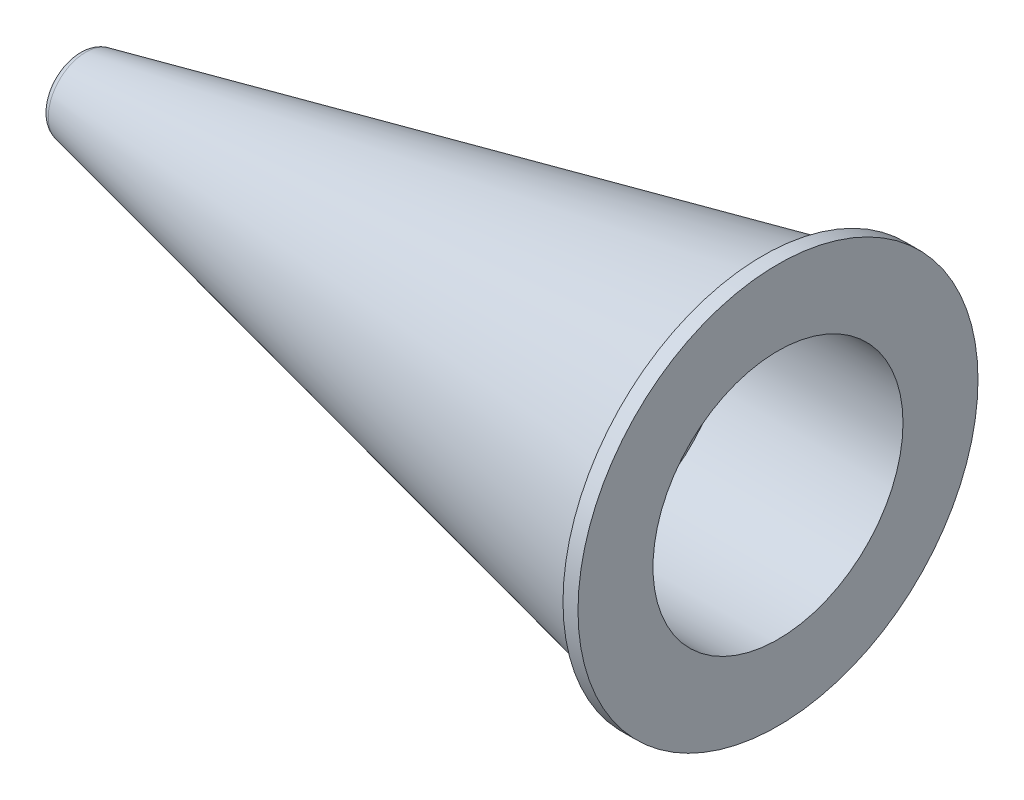
ISO-10303-21;
HEADER;
FILE_DESCRIPTION(('STEP AP214'),'2;1');
FILE_NAME('part.step','',(''),(''),'','','');
FILE_SCHEMA(('AUTOMOTIVE_DESIGN { 1 0 10303 214 1 1 1 1 }'));
ENDSEC;
DATA;
#1=APPLICATION_CONTEXT('core data for automotive mechanical design processes');
#2=APPLICATION_PROTOCOL_DEFINITION('international standard','automotive_design',2000,#1);
#3=PRODUCT_CONTEXT('',#1,'mechanical');
#4=PRODUCT('Part','Part','',(#3));
#5=PRODUCT_RELATED_PRODUCT_CATEGORY('part','',(#4));
#6=PRODUCT_DEFINITION_FORMATION('','',#4);
#7=PRODUCT_DEFINITION_CONTEXT('part definition',#1,'design');
#8=PRODUCT_DEFINITION('design','',#6,#7);
#9=PRODUCT_DEFINITION_SHAPE('','',#8);
#10=(LENGTH_UNIT() NAMED_UNIT(*) SI_UNIT(.MILLI.,.METRE.));
#11=(NAMED_UNIT(*) PLANE_ANGLE_UNIT() SI_UNIT($,.RADIAN.));
#12=(NAMED_UNIT(*) SI_UNIT($,.STERADIAN.) SOLID_ANGLE_UNIT());
#13=UNCERTAINTY_MEASURE_WITH_UNIT(LENGTH_MEASURE(1.E-05),#10,'distance_accuracy_value','');
#14=(GEOMETRIC_REPRESENTATION_CONTEXT(3) GLOBAL_UNCERTAINTY_ASSIGNED_CONTEXT((#13)) GLOBAL_UNIT_ASSIGNED_CONTEXT((#10,
#11,#12)) REPRESENTATION_CONTEXT('',''));
#15=CARTESIAN_POINT('',(0.,0.,0.));
#16=DIRECTION('',(0.,0.,1.));
#17=DIRECTION('',(1.,0.,0.));
#18=AXIS2_PLACEMENT_3D('',#15,#16,#17);
#19=CARTESIAN_POINT('',(-0.3,0.,0.));
#20=DIRECTION('',(1.,0.,0.));
#21=DIRECTION('',(0.,0.,-1.));
#22=AXIS2_PLACEMENT_3D('',#19,#20,#21);
#23=CONICAL_SURFACE('',#22,3.7,0.214343089656286);
#24=CARTESIAN_POINT('',(-13.842541119283,0.,0.));
#25=DIRECTION('',(1.,0.,0.));
#26=DIRECTION('',(0.,0.,-1.));
#27=AXIS2_PLACEMENT_3D('',#24,#25,#26);
#28=CIRCLE('',#27,0.751963837979211);
#29=CARTESIAN_POINT('',(-13.842541119283,0.,-0.751963837979212));
#30=VERTEX_POINT('',#29);
#31=EDGE_CURVE('E10',#30,#30,#28,.T.);
#32=CARTESIAN_POINT('',(-0.3,0.,0.));
#33=DIRECTION('',(-1.,0.,0.));
#34=DIRECTION('',(0.,0.,1.));
#35=AXIS2_PLACEMENT_3D('',#32,#33,#34);
#36=CIRCLE('',#35,3.7);
#37=CARTESIAN_POINT('',(-0.3,0.,-3.7));
#38=VERTEX_POINT('',#37);
#39=EDGE_CURVE('E53',#38,#38,#36,.T.);
#40=CARTESIAN_POINT('',(-13.842541119283,0.,-0.751963837979212));
#41=CARTESIAN_POINT('',(-13.7014729826238,0.,-0.782672548000262));
#42=CARTESIAN_POINT('',(-13.5604048459646,0.,-0.813381258021312));
#43=CARTESIAN_POINT('',(-13.2782685726462,0.,-0.874798678063411));
#44=CARTESIAN_POINT('',(-13.137200435987,0.,-0.905507388084461));
#45=CARTESIAN_POINT('',(-12.8550641626686,0.,-0.966924808126561));
#46=CARTESIAN_POINT('',(-12.7139960260094,0.,-0.997633518147611));
#47=CARTESIAN_POINT('',(-12.431859752691,0.,-1.05905093818971));
#48=CARTESIAN_POINT('',(-12.2907916160318,0.,-1.08975964821076));
#49=CARTESIAN_POINT('',(-12.0086553427134,0.,-1.15117706825286));
#50=CARTESIAN_POINT('',(-11.8675872060542,0.,-1.18188577827391));
#51=CARTESIAN_POINT('',(-11.5854509327358,0.,-1.24330319831601));
#52=CARTESIAN_POINT('',(-11.4443827960766,0.,-1.27401190833706));
#53=CARTESIAN_POINT('',(-11.1622465227582,0.,-1.33542932837916));
#54=CARTESIAN_POINT('',(-11.021178386099,0.,-1.36613803840021));
#55=CARTESIAN_POINT('',(-10.7390421127806,0.,-1.42755545844231));
#56=CARTESIAN_POINT('',(-10.5979739761214,0.,-1.45826416846336));
#57=CARTESIAN_POINT('',(-10.315837702803,0.,-1.51968158850546));
#58=CARTESIAN_POINT('',(-10.1747695661439,0.,-1.55039029852651));
#59=CARTESIAN_POINT('',(-9.89263329282546,0.,-1.61180771856861));
#60=CARTESIAN_POINT('',(-9.75156515616626,0.,-1.64251642858966));
#61=CARTESIAN_POINT('',(-9.46942888284786,0.,-1.70393384863176));
#62=CARTESIAN_POINT('',(-9.32836074618866,0.,-1.73464255865281));
#63=CARTESIAN_POINT('',(-9.04622447287027,0.,-1.79605997869491));
#64=CARTESIAN_POINT('',(-8.90515633621107,0.,-1.82676868871596));
#65=CARTESIAN_POINT('',(-8.62302006289267,0.,-1.88818610875806));
#66=CARTESIAN_POINT('',(-8.48195192623347,0.,-1.91889481877911));
#67=CARTESIAN_POINT('',(-8.19981565291508,0.,-1.98031223882121));
#68=CARTESIAN_POINT('',(-8.05874751625588,0.,-2.01102094884226));
#69=CARTESIAN_POINT('',(-7.77661124293749,0.,-2.07243836888436));
#70=CARTESIAN_POINT('',(-7.63554310627829,0.,-2.10314707890541));
#71=CARTESIAN_POINT('',(-7.35340683295989,0.,-2.16456449894751));
#72=CARTESIAN_POINT('',(-7.2123386963007,0.,-2.19527320896856));
#73=CARTESIAN_POINT('',(-6.9302024229823,0.,-2.25669062901066));
#74=CARTESIAN_POINT('',(-6.7891342863231,0.,-2.28739933903171));
#75=CARTESIAN_POINT('',(-6.50699801300471,0.,-2.34881675907381));
#76=CARTESIAN_POINT('',(-6.36592987634551,0.,-2.37952546909486));
#77=CARTESIAN_POINT('',(-6.08379360302711,0.,-2.44094288913695));
#78=CARTESIAN_POINT('',(-5.94272546636792,0.,-2.47165159915801));
#79=CARTESIAN_POINT('',(-5.66058919304952,0.,-2.5330690192001));
#80=CARTESIAN_POINT('',(-5.51952105639032,0.,-2.56377772922115));
#81=CARTESIAN_POINT('',(-5.23738478307193,0.,-2.62519514926325));
#82=CARTESIAN_POINT('',(-5.09631664641273,0.,-2.6559038592843));
#83=CARTESIAN_POINT('',(-4.81418037309433,0.,-2.7173212793264));
#84=CARTESIAN_POINT('',(-4.67311223643513,0.,-2.74802998934745));
#85=CARTESIAN_POINT('',(-4.39097596311674,0.,-2.80944740938955));
#86=CARTESIAN_POINT('',(-4.24990782645754,0.,-2.8401561194106));
#87=CARTESIAN_POINT('',(-3.96777155313915,0.,-2.9015735394527));
#88=CARTESIAN_POINT('',(-3.82670341647995,0.,-2.93228224947375));
#89=CARTESIAN_POINT('',(-3.54456714316155,0.,-2.99369966951585));
#90=CARTESIAN_POINT('',(-3.40349900650235,0.,-3.0244083795369));
#91=CARTESIAN_POINT('',(-3.12136273318396,0.,-3.085825799579));
#92=CARTESIAN_POINT('',(-2.98029459652476,0.,-3.11653450960005));
#93=CARTESIAN_POINT('',(-2.69815832320636,0.,-3.17795192964215));
#94=CARTESIAN_POINT('',(-2.55709018654716,0.,-3.2086606396632));
#95=CARTESIAN_POINT('',(-2.27495391322877,0.,-3.2700780597053));
#96=CARTESIAN_POINT('',(-2.13388577656957,0.,-3.30078676972635));
#97=CARTESIAN_POINT('',(-1.85174950325118,0.,-3.36220418976845));
#98=CARTESIAN_POINT('',(-1.71068136659198,0.,-3.3929128997895));
#99=CARTESIAN_POINT('',(-1.42854509327358,0.,-3.4543303198316));
#100=CARTESIAN_POINT('',(-1.28747695661438,0.,-3.48503902985265));
#101=CARTESIAN_POINT('',(-1.00534068329599,0.,-3.54645644989475));
#102=CARTESIAN_POINT('',(-0.864272546636791,0.,-3.5771651599158));
#103=CARTESIAN_POINT('',(-0.582136273318396,0.,-3.6385825799579));
#104=CARTESIAN_POINT('',(-0.441068136659198,0.,-3.66929128997895));
#105=CARTESIAN_POINT('',(-0.3,0.,-3.7));
#106=B_SPLINE_CURVE_WITH_KNOTS('',3,(#40,#41,#42,#43,#44,#45,#46,#47,#48,#49,#50,#51,#52,#53,
#54,#55,#56,#57,#58,#59,#60,#61,#62,#63,#64,#65,#66,#67,#68,#69,#70,#71,#72,#73,#74,#75,#76,#77,
#78,#79,#80,#81,#82,#83,#84,#85,#86,#87,#88,#89,#90,#91,#92,#93,#94,#95,#96,#97,#98,#99,#100,
#101,#102,#103,#104,#105),.UNSPECIFIED.,.F.,.F.,(4,2,2,2,2,2,2,2,2,2,2,2,2,2,2,2,2,2,2,2,2,2,2,
2,2,2,2,2,2,2,2,2,4),(0.,0.433115684852091,0.866231369704181,1.29934705455627,1.73246273940836,
2.16557842426045,2.59869410911254,3.03180979396463,3.46492547881672,3.89804116366881,
4.3311568485209,4.76427253337299,5.19738821822509,5.63050390307718,6.06361958792927,
6.49673527278136,6.92985095763345,7.36296664248554,7.79608232733763,8.22919801218972,
8.66231369704181,9.0954293818939,9.52854506674599,9.96166075159809,10.3947764364502,
10.8278921213023,11.2610078061544,11.6941234910065,12.1272391758585,12.5603548607106,
12.9934705455627,13.4265862304148,13.8597019152669),.UNSPECIFIED.);
#107=EDGE_CURVE('BSEAM33',#30,#38,#106,.T.);
#108=ORIENTED_EDGE('',*,*,#31,.T.);
#109=ORIENTED_EDGE('',*,*,#39,.T.);
#110=ORIENTED_EDGE('',*,*,#107,.T.);
#111=ORIENTED_EDGE('',*,*,#107,.F.);
#112=EDGE_LOOP('',(#108,#110,#109,#111));
#113=FACE_BOUND('',#112,.T.);
#114=ADVANCED_FACE('F33',(#113),#23,.T.);
#115=CARTESIAN_POINT('',(0.,0.,0.));
#116=DIRECTION('',(-1.,0.,0.));
#117=DIRECTION('',(0.,0.,1.));
#118=AXIS2_PLACEMENT_3D('',#115,#116,#117);
#119=PLANE('',#118);
#120=CARTESIAN_POINT('',(0.,0.,0.));
#121=DIRECTION('',(1.,0.,0.));
#122=DIRECTION('',(0.,0.,-1.));
#123=AXIS2_PLACEMENT_3D('',#120,#121,#122);
#124=CIRCLE('',#123,2.5);
#125=CARTESIAN_POINT('',(0.,0.,-2.5));
#126=VERTEX_POINT('',#125);
#127=EDGE_CURVE('E57',#126,#126,#124,.T.);
#128=ORIENTED_EDGE('',*,*,#127,.F.);
#129=EDGE_LOOP('',(#128));
#130=FACE_BOUND('',#129,.T.);
#131=CARTESIAN_POINT('',(0.,0.,0.));
#132=DIRECTION('',(-1.,0.,0.));
#133=DIRECTION('',(0.,0.,1.));
#134=AXIS2_PLACEMENT_3D('',#131,#132,#133);
#135=CIRCLE('',#134,4.);
#136=CARTESIAN_POINT('',(0.,0.,4.));
#137=VERTEX_POINT('',#136);
#138=EDGE_CURVE('E44',#137,#137,#135,.T.);
#139=ORIENTED_EDGE('',*,*,#138,.F.);
#140=EDGE_LOOP('',(#139));
#141=FACE_BOUND('',#140,.T.);
#142=ADVANCED_FACE('F85',(#130,#141),#119,.F.);
#143=CARTESIAN_POINT('',(-15.,0.,0.));
#144=DIRECTION('',(-1.,0.,0.));
#145=DIRECTION('',(0.,0.,1.));
#146=AXIS2_PLACEMENT_3D('',#143,#144,#145);
#147=CYLINDRICAL_SURFACE('',#146,4.);
#148=CARTESIAN_POINT('',(-0.3,0.,0.));
#149=DIRECTION('',(-1.,0.,0.));
#150=DIRECTION('',(0.,0.,1.));
#151=AXIS2_PLACEMENT_3D('',#148,#149,#150);
#152=CIRCLE('',#151,4.);
#153=CARTESIAN_POINT('',(-0.3,0.,4.));
#154=VERTEX_POINT('',#153);
#155=EDGE_CURVE('E48',#154,#154,#152,.T.);
#156=ORIENTED_EDGE('',*,*,#155,.F.);
#157=EDGE_LOOP('',(#156));
#158=FACE_BOUND('',#157,.T.);
#159=ORIENTED_EDGE('',*,*,#138,.T.);
#160=EDGE_LOOP('',(#159));
#161=FACE_BOUND('',#160,.T.);
#162=ADVANCED_FACE('F90',(#158,#161),#147,.T.);
#163=CARTESIAN_POINT('',(-0.3,4.,0.));
#164=DIRECTION('',(1.,0.,0.));
#165=DIRECTION('',(0.,0.,-1.));
#166=AXIS2_PLACEMENT_3D('',#163,#164,#165);
#167=PLANE('',#166);
#168=ORIENTED_EDGE('',*,*,#39,.F.);
#169=EDGE_LOOP('',(#168));
#170=FACE_BOUND('',#169,.T.);
#171=ORIENTED_EDGE('',*,*,#155,.T.);
#172=EDGE_LOOP('',(#171));
#173=FACE_BOUND('',#172,.T.);
#174=ADVANCED_FACE('F95',(#170,#173),#167,.F.);
#175=CARTESIAN_POINT('',(-3.5,0.,0.));
#176=DIRECTION('',(1.,0.,0.));
#177=DIRECTION('',(0.,0.,-1.));
#178=AXIS2_PLACEMENT_3D('',#175,#176,#177);
#179=CYLINDRICAL_SURFACE('',#178,2.5);
#180=CARTESIAN_POINT('',(-3.5,0.,0.));
#181=DIRECTION('',(1.,0.,0.));
#182=DIRECTION('',(0.,0.,-1.));
#183=AXIS2_PLACEMENT_3D('',#180,#181,#182);
#184=CIRCLE('',#183,2.5);
#185=CARTESIAN_POINT('',(-3.5,0.,-2.5));
#186=VERTEX_POINT('',#185);
#187=EDGE_CURVE('E56',#186,#186,#184,.T.);
#188=ORIENTED_EDGE('',*,*,#187,.F.);
#189=EDGE_LOOP('',(#188));
#190=FACE_BOUND('',#189,.T.);
#191=ORIENTED_EDGE('',*,*,#127,.T.);
#192=EDGE_LOOP('',(#191));
#193=FACE_BOUND('',#192,.T.);
#194=ADVANCED_FACE('F80',(#190,#193),#179,.F.);
#195=CARTESIAN_POINT('',(-3.5,0.,0.));
#196=DIRECTION('',(1.,0.,0.));
#197=DIRECTION('',(0.,0.,-1.));
#198=AXIS2_PLACEMENT_3D('',#195,#196,#197);
#199=PLANE('',#198);
#200=ORIENTED_EDGE('',*,*,#187,.T.);
#201=EDGE_LOOP('',(#200));
#202=FACE_BOUND('',#201,.T.);
#203=ADVANCED_FACE('F73',(#202),#199,.T.);
#204=CARTESIAN_POINT('',(-14.,0.,0.));
#205=DIRECTION('',(-1.,0.,0.));
#206=DIRECTION('',(0.,0.,1.));
#207=AXIS2_PLACEMENT_3D('',#204,#205,#206);
#208=PLANE('',#207);
#209=CARTESIAN_POINT('',(-14.,0.,0.));
#210=DIRECTION('',(-1.,0.,0.));
#211=DIRECTION('',(0.,0.,1.));
#212=AXIS2_PLACEMENT_3D('',#209,#210,#211);
#213=CIRCLE('',#212,0.05);
#214=CARTESIAN_POINT('',(-14.,0.,0.05));
#215=VERTEX_POINT('',#214);
#216=EDGE_CURVE('E65',#215,#215,#213,.T.);
#217=ORIENTED_EDGE('',*,*,#216,.F.);
#218=EDGE_LOOP('',(#217));
#219=FACE_BOUND('',#218,.T.);
#220=CARTESIAN_POINT('',(-14.,0.,0.));
#221=DIRECTION('',(-1.,0.,0.));
#222=DIRECTION('',(0.,0.,1.));
#223=AXIS2_PLACEMENT_3D('',#220,#221,#222);
#224=CIRCLE('',#223,0.556540571272942);
#225=CARTESIAN_POINT('',(-14.,0.,0.556540571272942));
#226=VERTEX_POINT('',#225);
#227=EDGE_CURVE('E40',#226,#226,#224,.T.);
#228=ORIENTED_EDGE('',*,*,#227,.T.);
#229=EDGE_LOOP('',(#228));
#230=FACE_BOUND('',#229,.T.);
#231=ADVANCED_FACE('F71',(#219,#230),#208,.T.);
#232=CARTESIAN_POINT('',(-13.8,0.,0.));
#233=DIRECTION('',(-1.,0.,0.));
#234=DIRECTION('',(0.,0.,1.));
#235=AXIS2_PLACEMENT_3D('',#232,#233,#234);
#236=TOROIDAL_SURFACE('',#235,0.556540571272942,0.2);
#237=ORIENTED_EDGE('',*,*,#31,.F.);
#238=EDGE_LOOP('',(#237));
#239=FACE_BOUND('',#238,.T.);
#240=ORIENTED_EDGE('',*,*,#227,.F.);
#241=EDGE_LOOP('',(#240));
#242=FACE_BOUND('',#241,.T.);
#243=ADVANCED_FACE('F35',(#239,#242),#236,.T.);
#244=CARTESIAN_POINT('',(-14.,0.,0.));
#245=DIRECTION('',(1.,0.,0.));
#246=DIRECTION('',(0.,0.,-1.));
#247=AXIS2_PLACEMENT_3D('',#244,#245,#246);
#248=CONICAL_SURFACE('',#247,0.05,0.380506377112367);
#249=CARTESIAN_POINT('',(-14.05,0.,0.));
#250=DIRECTION('',(-1.,0.,0.));
#251=DIRECTION('',(0.,0.,1.));
#252=AXIS2_PLACEMENT_3D('',#249,#250,#251);
#253=CIRCLE('',#252,0.03);
#254=CARTESIAN_POINT('',(-14.05,0.,0.03));
#255=VERTEX_POINT('',#254);
#256=EDGE_CURVE('E60',#255,#255,#253,.T.);
#257=ORIENTED_EDGE('',*,*,#256,.F.);
#258=EDGE_LOOP('',(#257));
#259=FACE_BOUND('',#258,.T.);
#260=ORIENTED_EDGE('',*,*,#216,.T.);
#261=EDGE_LOOP('',(#260));
#262=FACE_BOUND('',#261,.T.);
#263=ADVANCED_FACE('F69',(#259,#262),#248,.T.);
#264=CARTESIAN_POINT('',(-14.05,0.,0.));
#265=DIRECTION('',(-1.,0.,0.));
#266=DIRECTION('',(0.,0.,1.));
#267=AXIS2_PLACEMENT_3D('',#264,#265,#266);
#268=PLANE('',#267);
#269=ORIENTED_EDGE('',*,*,#256,.T.);
#270=EDGE_LOOP('',(#269));
#271=FACE_BOUND('',#270,.T.);
#272=ADVANCED_FACE('F148',(#271),#268,.T.);
#273=CLOSED_SHELL('',(#114,#142,#162,#174,#194,#203,#231,#243,#263,#272));
#274=MANIFOLD_SOLID_BREP('B2',#273);
#275=ADVANCED_BREP_SHAPE_REPRESENTATION('',(#18,#274),#14);
#276=SHAPE_DEFINITION_REPRESENTATION(#9,#275);
ENDSEC;
END-ISO-10303-21;
